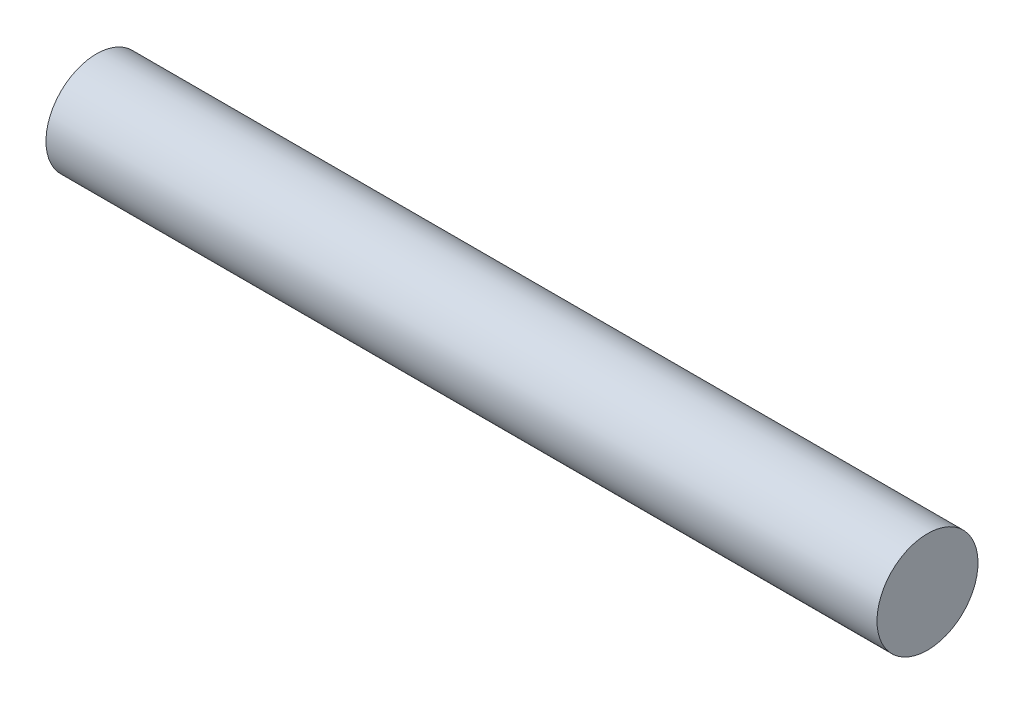
ISO-10303-21;
HEADER;
FILE_DESCRIPTION(('STEP AP214'),'2;1');
FILE_NAME('part.step','',(''),(''),'','','');
FILE_SCHEMA(('AUTOMOTIVE_DESIGN { 1 0 10303 214 1 1 1 1 }'));
ENDSEC;
DATA;
#1=APPLICATION_CONTEXT('core data for automotive mechanical design processes');
#2=APPLICATION_PROTOCOL_DEFINITION('international standard','automotive_design',2000,#1);
#3=PRODUCT_CONTEXT('',#1,'mechanical');
#4=PRODUCT('Part','Part','',(#3));
#5=PRODUCT_RELATED_PRODUCT_CATEGORY('part','',(#4));
#6=PRODUCT_DEFINITION_FORMATION('','',#4);
#7=PRODUCT_DEFINITION_CONTEXT('part definition',#1,'design');
#8=PRODUCT_DEFINITION('design','',#6,#7);
#9=PRODUCT_DEFINITION_SHAPE('','',#8);
#10=(LENGTH_UNIT() NAMED_UNIT(*) SI_UNIT(.MILLI.,.METRE.));
#11=(NAMED_UNIT(*) PLANE_ANGLE_UNIT() SI_UNIT($,.RADIAN.));
#12=(NAMED_UNIT(*) SI_UNIT($,.STERADIAN.) SOLID_ANGLE_UNIT());
#13=UNCERTAINTY_MEASURE_WITH_UNIT(LENGTH_MEASURE(1.E-05),#10,'distance_accuracy_value','');
#14=(GEOMETRIC_REPRESENTATION_CONTEXT(3) GLOBAL_UNCERTAINTY_ASSIGNED_CONTEXT((#13)) GLOBAL_UNIT_ASSIGNED_CONTEXT((#10,
#11,#12)) REPRESENTATION_CONTEXT('',''));
#15=CARTESIAN_POINT('',(0.,0.,0.));
#16=DIRECTION('',(0.,0.,1.));
#17=DIRECTION('',(1.,0.,0.));
#18=AXIS2_PLACEMENT_3D('',#15,#16,#17);
#19=CARTESIAN_POINT('',(0.,0.,0.));
#20=DIRECTION('',(1.,0.,0.));
#21=DIRECTION('',(0.,0.,-1.));
#22=AXIS2_PLACEMENT_3D('',#19,#20,#21);
#23=PLANE('',#22);
#24=CARTESIAN_POINT('',(0.,0.,0.));
#25=DIRECTION('',(1.,0.,0.));
#26=DIRECTION('',(0.,0.,-1.));
#27=AXIS2_PLACEMENT_3D('',#24,#25,#26);
#28=CIRCLE('',#27,3.57);
#29=CARTESIAN_POINT('',(0.,0.,-3.57));
#30=VERTEX_POINT('',#29);
#31=EDGE_CURVE('E46',#30,#30,#28,.T.);
#32=ORIENTED_EDGE('',*,*,#31,.F.);
#33=EDGE_LOOP('',(#32));
#34=FACE_BOUND('',#33,.T.);
#35=ADVANCED_FACE('F39',(#34),#23,.F.);
#36=CARTESIAN_POINT('',(68.8222848353465,0.,0.));
#37=DIRECTION('',(-1.,0.,0.));
#38=DIRECTION('',(0.,0.,1.));
#39=AXIS2_PLACEMENT_3D('',#36,#37,#38);
#40=CYLINDRICAL_SURFACE('',#39,3.57);
#41=CARTESIAN_POINT('',(58.7248000000026,0.,0.));
#42=DIRECTION('',(-1.,0.,0.));
#43=DIRECTION('',(0.,-1.,0.));
#44=AXIS2_PLACEMENT_3D('',#41,#42,#43);
#45=CIRCLE('',#44,3.57);
#46=CARTESIAN_POINT('',(58.7248000000026,-3.57,0.));
#47=VERTEX_POINT('',#46);
#48=EDGE_CURVE('E10',#47,#47,#45,.T.);
#49=ORIENTED_EDGE('',*,*,#48,.T.);
#50=EDGE_LOOP('',(#49));
#51=FACE_BOUND('',#50,.T.);
#52=ORIENTED_EDGE('',*,*,#31,.T.);
#53=EDGE_LOOP('',(#52));
#54=FACE_BOUND('',#53,.T.);
#55=ADVANCED_FACE('F41',(#51,#54),#40,.T.);
#56=CARTESIAN_POINT('',(58.7248000000026,-2.8781583977567E-12,3.57187500000044));
#57=DIRECTION('',(-1.,0.,0.));
#58=DIRECTION('',(0.,-1.,0.));
#59=AXIS2_PLACEMENT_3D('',#56,#57,#58);
#60=PLANE('',#59);
#61=ORIENTED_EDGE('',*,*,#48,.F.);
#62=EDGE_LOOP('',(#61));
#63=FACE_BOUND('',#62,.T.);
#64=ADVANCED_FACE('F57',(#63),#60,.F.);
#65=CLOSED_SHELL('',(#35,#55,#64));
#66=MANIFOLD_SOLID_BREP('B2',#65);
#67=ADVANCED_BREP_SHAPE_REPRESENTATION('',(#18,#66),#14);
#68=SHAPE_DEFINITION_REPRESENTATION(#9,#67);
ENDSEC;
END-ISO-10303-21;
